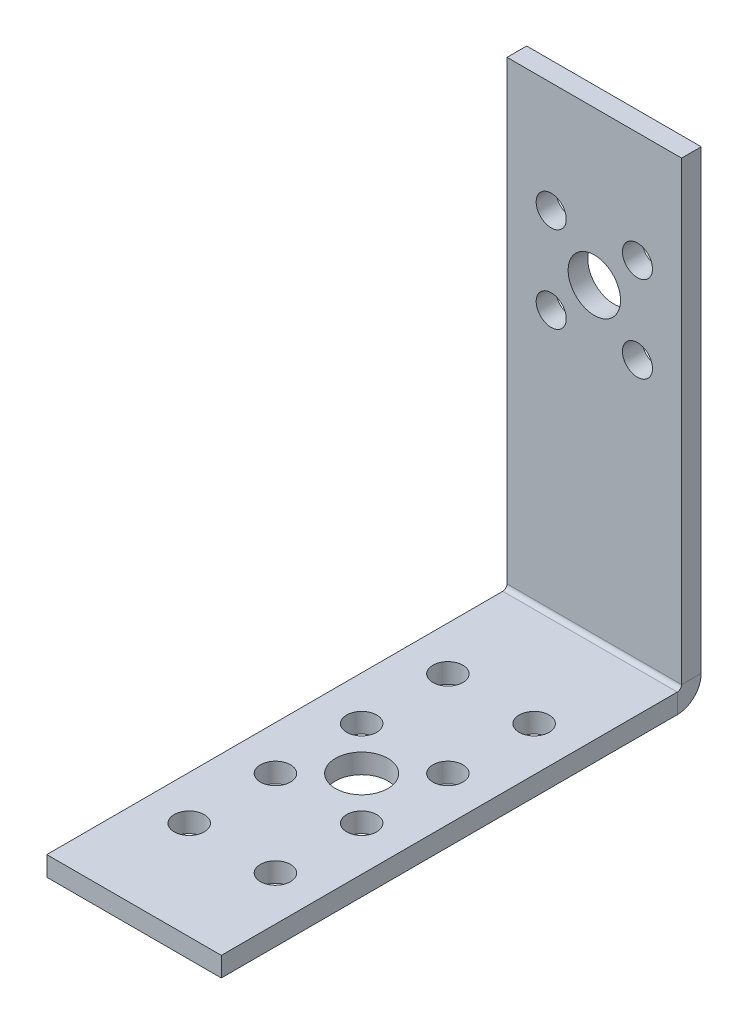
ISO-10303-21;
HEADER;
FILE_DESCRIPTION(('STEP AP214'),'2;1');
FILE_NAME('part.step','',(''),(''),'','','');
FILE_SCHEMA(('AUTOMOTIVE_DESIGN { 1 0 10303 214 1 1 1 1 }'));
ENDSEC;
DATA;
#1=APPLICATION_CONTEXT('core data for automotive mechanical design processes');
#2=APPLICATION_PROTOCOL_DEFINITION('international standard','automotive_design',2000,#1);
#3=PRODUCT_CONTEXT('',#1,'mechanical');
#4=PRODUCT('Part','Part','',(#3));
#5=PRODUCT_RELATED_PRODUCT_CATEGORY('part','',(#4));
#6=PRODUCT_DEFINITION_FORMATION('','',#4);
#7=PRODUCT_DEFINITION_CONTEXT('part definition',#1,'design');
#8=PRODUCT_DEFINITION('design','',#6,#7);
#9=PRODUCT_DEFINITION_SHAPE('','',#8);
#10=(LENGTH_UNIT() NAMED_UNIT(*) SI_UNIT(.MILLI.,.METRE.));
#11=(NAMED_UNIT(*) PLANE_ANGLE_UNIT() SI_UNIT($,.RADIAN.));
#12=(NAMED_UNIT(*) SI_UNIT($,.STERADIAN.) SOLID_ANGLE_UNIT());
#13=UNCERTAINTY_MEASURE_WITH_UNIT(LENGTH_MEASURE(1.E-05),#10,'distance_accuracy_value','');
#14=(GEOMETRIC_REPRESENTATION_CONTEXT(3) GLOBAL_UNCERTAINTY_ASSIGNED_CONTEXT((#13)) GLOBAL_UNIT_ASSIGNED_CONTEXT((#10,
#11,#12)) REPRESENTATION_CONTEXT('',''));
#15=CARTESIAN_POINT('',(0.,0.,0.));
#16=DIRECTION('',(0.,0.,1.));
#17=DIRECTION('',(1.,0.,0.));
#18=AXIS2_PLACEMENT_3D('',#15,#16,#17);
#19=CARTESIAN_POINT('',(-10.16,-2.286,27.94));
#20=DIRECTION('',(-1.,0.,0.));
#21=DIRECTION('',(0.,0.,1.));
#22=AXIS2_PLACEMENT_3D('',#19,#20,#21);
#23=PLANE('',#22);
#24=DIRECTION('',(0.,0.,1.));
#25=VECTOR('',#24,1.);
#26=CARTESIAN_POINT('',(-10.16,0.,27.94));
#27=LINE('',#26,#25);
#28=CARTESIAN_POINT('',(-10.16,0.,-25.154));
#29=VERTEX_POINT('',#28);
#30=CARTESIAN_POINT('',(-10.16,0.,27.94));
#31=VERTEX_POINT('',#30);
#32=EDGE_CURVE('E119',#29,#31,#27,.T.);
#33=ORIENTED_EDGE('',*,*,#32,.F.);
#34=DIRECTION('',(0.,-1.,0.));
#35=VECTOR('',#34,1.);
#36=CARTESIAN_POINT('',(-10.16,0.,-25.154));
#37=LINE('',#36,#35);
#38=CARTESIAN_POINT('',(-10.16,-2.28600000000001,-25.154));
#39=VERTEX_POINT('',#38);
#40=EDGE_CURVE('E163',#29,#39,#37,.T.);
#41=ORIENTED_EDGE('',*,*,#40,.T.);
#42=DIRECTION('',(0.,0.,1.));
#43=VECTOR('',#42,1.);
#44=CARTESIAN_POINT('',(-10.16,-2.286,27.94));
#45=LINE('',#44,#43);
#46=CARTESIAN_POINT('',(-10.16,-2.286,27.94));
#47=VERTEX_POINT('',#46);
#48=EDGE_CURVE('E115',#39,#47,#45,.T.);
#49=ORIENTED_EDGE('',*,*,#48,.T.);
#50=DIRECTION('',(0.,1.,0.));
#51=VECTOR('',#50,1.);
#52=CARTESIAN_POINT('',(-10.16,-2.286,27.94));
#53=LINE('',#52,#51);
#54=EDGE_CURVE('E73',#47,#31,#53,.T.);
#55=ORIENTED_EDGE('',*,*,#54,.T.);
#56=EDGE_LOOP('',(#33,#41,#49,#55));
#57=FACE_BOUND('',#56,.T.);
#58=ADVANCED_FACE('F65',(#57),#23,.T.);
#59=CARTESIAN_POINT('',(0.,-2.286,0.));
#60=DIRECTION('',(0.,-1.,0.));
#61=DIRECTION('',(0.,0.,-1.));
#62=AXIS2_PLACEMENT_3D('',#59,#60,#61);
#63=PLANE('',#62);
#64=CARTESIAN_POINT('',(-5.03045816676045,-2.28600000000001,16.4873744413615));
#65=DIRECTION('',(0.,1.,0.));
#66=DIRECTION('',(0.,0.,1.));
#67=AXIS2_PLACEMENT_3D('',#64,#65,#66);
#68=CIRCLE('',#67,1.75);
#69=CARTESIAN_POINT('',(-5.03045816676045,-2.28600000000001,18.2373744413615));
#70=VERTEX_POINT('',#69);
#71=EDGE_CURVE('E269',#70,#70,#68,.T.);
#72=ORIENTED_EDGE('',*,*,#71,.T.);
#73=EDGE_LOOP('',(#72));
#74=FACE_BOUND('',#73,.T.);
#75=CARTESIAN_POINT('',(-5.03045816676045,-2.28600000000001,-3.5944581443364));
#76=DIRECTION('',(0.,1.,0.));
#77=DIRECTION('',(0.,0.,1.));
#78=AXIS2_PLACEMENT_3D('',#75,#76,#77);
#79=CIRCLE('',#78,1.75);
#80=CARTESIAN_POINT('',(-5.03045816676045,-2.28600000000001,-1.8444581443364));
#81=VERTEX_POINT('',#80);
#82=EDGE_CURVE('E288',#81,#81,#79,.T.);
#83=ORIENTED_EDGE('',*,*,#82,.T.);
#84=EDGE_LOOP('',(#83));
#85=FACE_BOUND('',#84,.T.);
#86=CARTESIAN_POINT('',(5.01045812608854,-2.28600000000001,-13.6353744371854));
#87=DIRECTION('',(0.,1.,0.));
#88=DIRECTION('',(0.,0.,1.));
#89=AXIS2_PLACEMENT_3D('',#86,#87,#88);
#90=CIRCLE('',#89,1.75);
#91=CARTESIAN_POINT('',(5.01045812608854,-2.28600000000001,-11.8853744371854));
#92=VERTEX_POINT('',#91);
#93=EDGE_CURVE('E282',#92,#92,#90,.T.);
#94=ORIENTED_EDGE('',*,*,#93,.T.);
#95=EDGE_LOOP('',(#94));
#96=FACE_BOUND('',#95,.T.);
#97=CARTESIAN_POINT('',(5.01045812608854,-2.28600000000001,6.44645814851258));
#98=DIRECTION('',(0.,1.,0.));
#99=DIRECTION('',(0.,0.,1.));
#100=AXIS2_PLACEMENT_3D('',#97,#98,#99);
#101=CIRCLE('',#100,1.75);
#102=CARTESIAN_POINT('',(5.01045812608854,-2.28600000000001,8.19645814851258));
#103=VERTEX_POINT('',#102);
#104=EDGE_CURVE('E275',#103,#103,#101,.T.);
#105=ORIENTED_EDGE('',*,*,#104,.T.);
#106=EDGE_LOOP('',(#105));
#107=FACE_BOUND('',#106,.T.);
#108=CARTESIAN_POINT('',(5.01045812608854,-2.28600000000001,-3.5944581443364));
#109=DIRECTION('',(0.,1.,0.));
#110=DIRECTION('',(0.,0.,1.));
#111=AXIS2_PLACEMENT_3D('',#108,#109,#110);
#112=CIRCLE('',#111,1.75);
#113=CARTESIAN_POINT('',(5.01045812608854,-2.28600000000001,-1.8444581443364));
#114=VERTEX_POINT('',#113);
#115=EDGE_CURVE('E311',#114,#114,#112,.T.);
#116=ORIENTED_EDGE('',*,*,#115,.T.);
#117=EDGE_LOOP('',(#116));
#118=FACE_BOUND('',#117,.T.);
#119=CARTESIAN_POINT('',(-5.03045816676045,-2.28600000000001,6.44645814851258));
#120=DIRECTION('',(0.,1.,0.));
#121=DIRECTION('',(0.,0.,1.));
#122=AXIS2_PLACEMENT_3D('',#119,#120,#121);
#123=CIRCLE('',#122,1.75);
#124=CARTESIAN_POINT('',(-5.03045816676045,-2.28600000000001,8.19645814851258));
#125=VERTEX_POINT('',#124);
#126=EDGE_CURVE('E300',#125,#125,#123,.T.);
#127=ORIENTED_EDGE('',*,*,#126,.T.);
#128=EDGE_LOOP('',(#127));
#129=FACE_BOUND('',#128,.T.);
#130=CARTESIAN_POINT('',(-5.03045816676045,-2.28600000000001,-13.6353744371854));
#131=DIRECTION('',(0.,1.,0.));
#132=DIRECTION('',(0.,0.,1.));
#133=AXIS2_PLACEMENT_3D('',#130,#131,#132);
#134=CIRCLE('',#133,1.75);
#135=CARTESIAN_POINT('',(-5.03045816676045,-2.28600000000001,-11.8853744371854));
#136=VERTEX_POINT('',#135);
#137=EDGE_CURVE('E299',#136,#136,#134,.T.);
#138=ORIENTED_EDGE('',*,*,#137,.T.);
#139=EDGE_LOOP('',(#138));
#140=FACE_BOUND('',#139,.T.);
#141=CARTESIAN_POINT('',(5.01045812608854,-2.28600000000001,16.4873744413615));
#142=DIRECTION('',(0.,1.,0.));
#143=DIRECTION('',(0.,0.,1.));
#144=AXIS2_PLACEMENT_3D('',#141,#142,#143);
#145=CIRCLE('',#144,1.75);
#146=CARTESIAN_POINT('',(5.01045812608854,-2.28600000000001,18.2373744413615));
#147=VERTEX_POINT('',#146);
#148=EDGE_CURVE('E276',#147,#147,#145,.T.);
#149=ORIENTED_EDGE('',*,*,#148,.T.);
#150=EDGE_LOOP('',(#149));
#151=FACE_BOUND('',#150,.T.);
#152=CARTESIAN_POINT('',(-0.0100000203359513,-2.28600000000001,1.42600000208809));
#153=DIRECTION('',(0.,1.,0.));
#154=DIRECTION('',(0.,0.,1.));
#155=AXIS2_PLACEMENT_3D('',#152,#153,#154);
#156=CIRCLE('',#155,3.04999999999998);
#157=CARTESIAN_POINT('',(-0.0100000203359513,-2.28600000000001,4.47600000208808));
#158=VERTEX_POINT('',#157);
#159=EDGE_CURVE('E258',#158,#158,#156,.T.);
#160=ORIENTED_EDGE('',*,*,#159,.T.);
#161=EDGE_LOOP('',(#160));
#162=FACE_BOUND('',#161,.T.);
#163=ORIENTED_EDGE('',*,*,#48,.F.);
#164=DIRECTION('',(-1.,0.,0.));
#165=VECTOR('',#164,1.);
#166=CARTESIAN_POINT('',(-10.16,-2.28600000000001,-25.154));
#167=LINE('',#166,#165);
#168=CARTESIAN_POINT('',(10.16,-2.286,-25.154));
#169=VERTEX_POINT('',#168);
#170=EDGE_CURVE('E158',#39,#169,#167,.F.);
#171=ORIENTED_EDGE('',*,*,#170,.T.);
#172=DIRECTION('',(0.,0.,-1.));
#173=VECTOR('',#172,1.);
#174=CARTESIAN_POINT('',(10.16,-2.286,27.94));
#175=LINE('',#174,#173);
#176=CARTESIAN_POINT('',(10.16,-2.286,27.94));
#177=VERTEX_POINT('',#176);
#178=EDGE_CURVE('E126',#177,#169,#175,.T.);
#179=ORIENTED_EDGE('',*,*,#178,.F.);
#180=DIRECTION('',(1.,0.,0.));
#181=VECTOR('',#180,1.);
#182=CARTESIAN_POINT('',(-10.16,-2.286,27.94));
#183=LINE('',#182,#181);
#184=EDGE_CURVE('E106',#47,#177,#183,.T.);
#185=ORIENTED_EDGE('',*,*,#184,.F.);
#186=EDGE_LOOP('',(#163,#171,#179,#185));
#187=FACE_BOUND('',#186,.T.);
#188=ADVANCED_FACE('F182',(#74,#85,#96,#107,#118,#129,#140,#151,#162,#187),#63,.T.);
#189=CARTESIAN_POINT('',(0.,0.,0.));
#190=DIRECTION('',(0.,-1.,0.));
#191=DIRECTION('',(0.,0.,-1.));
#192=AXIS2_PLACEMENT_3D('',#189,#190,#191);
#193=PLANE('',#192);
#194=CARTESIAN_POINT('',(-5.03045816676045,0.,16.4873744413615));
#195=DIRECTION('',(0.,1.,0.));
#196=DIRECTION('',(0.,0.,1.));
#197=AXIS2_PLACEMENT_3D('',#194,#195,#196);
#198=CIRCLE('',#197,1.75);
#199=CARTESIAN_POINT('',(-5.03045816676045,0.,18.2373744413615));
#200=VERTEX_POINT('',#199);
#201=EDGE_CURVE('E291',#200,#200,#198,.T.);
#202=ORIENTED_EDGE('',*,*,#201,.F.);
#203=EDGE_LOOP('',(#202));
#204=FACE_BOUND('',#203,.T.);
#205=CARTESIAN_POINT('',(-5.03045816676045,0.,-3.5944581443364));
#206=DIRECTION('',(0.,1.,0.));
#207=DIRECTION('',(0.,0.,1.));
#208=AXIS2_PLACEMENT_3D('',#205,#206,#207);
#209=CIRCLE('',#208,1.75);
#210=CARTESIAN_POINT('',(-5.03045816676045,0.,-1.8444581443364));
#211=VERTEX_POINT('',#210);
#212=EDGE_CURVE('E285',#211,#211,#209,.T.);
#213=ORIENTED_EDGE('',*,*,#212,.F.);
#214=EDGE_LOOP('',(#213));
#215=FACE_BOUND('',#214,.T.);
#216=CARTESIAN_POINT('',(5.01045812608854,0.,-13.6353744371854));
#217=DIRECTION('',(0.,1.,0.));
#218=DIRECTION('',(0.,0.,1.));
#219=AXIS2_PLACEMENT_3D('',#216,#217,#218);
#220=CIRCLE('',#219,1.75);
#221=CARTESIAN_POINT('',(5.01045812608854,0.,-11.8853744371854));
#222=VERTEX_POINT('',#221);
#223=EDGE_CURVE('E279',#222,#222,#220,.T.);
#224=ORIENTED_EDGE('',*,*,#223,.F.);
#225=EDGE_LOOP('',(#224));
#226=FACE_BOUND('',#225,.T.);
#227=CARTESIAN_POINT('',(5.01045812608854,0.,6.44645814851258));
#228=DIRECTION('',(0.,1.,0.));
#229=DIRECTION('',(0.,0.,1.));
#230=AXIS2_PLACEMENT_3D('',#227,#228,#229);
#231=CIRCLE('',#230,1.75);
#232=CARTESIAN_POINT('',(5.01045812608854,0.,8.19645814851258));
#233=VERTEX_POINT('',#232);
#234=EDGE_CURVE('E272',#233,#233,#231,.T.);
#235=ORIENTED_EDGE('',*,*,#234,.F.);
#236=EDGE_LOOP('',(#235));
#237=FACE_BOUND('',#236,.T.);
#238=CARTESIAN_POINT('',(5.01045812608854,0.,-3.5944581443364));
#239=DIRECTION('',(0.,1.,0.));
#240=DIRECTION('',(0.,0.,1.));
#241=AXIS2_PLACEMENT_3D('',#238,#239,#240);
#242=CIRCLE('',#241,1.75);
#243=CARTESIAN_POINT('',(5.01045812608854,0.,-1.8444581443364));
#244=VERTEX_POINT('',#243);
#245=EDGE_CURVE('E308',#244,#244,#242,.T.);
#246=ORIENTED_EDGE('',*,*,#245,.F.);
#247=EDGE_LOOP('',(#246));
#248=FACE_BOUND('',#247,.T.);
#249=CARTESIAN_POINT('',(-5.03045816676045,0.,6.44645814851258));
#250=DIRECTION('',(0.,1.,0.));
#251=DIRECTION('',(0.,0.,1.));
#252=AXIS2_PLACEMENT_3D('',#249,#250,#251);
#253=CIRCLE('',#252,1.75);
#254=CARTESIAN_POINT('',(-5.03045816676045,0.,8.19645814851258));
#255=VERTEX_POINT('',#254);
#256=EDGE_CURVE('E314',#255,#255,#253,.T.);
#257=ORIENTED_EDGE('',*,*,#256,.F.);
#258=EDGE_LOOP('',(#257));
#259=FACE_BOUND('',#258,.T.);
#260=CARTESIAN_POINT('',(-5.03045816676045,0.,-13.6353744371854));
#261=DIRECTION('',(0.,1.,0.));
#262=DIRECTION('',(0.,0.,1.));
#263=AXIS2_PLACEMENT_3D('',#260,#261,#262);
#264=CIRCLE('',#263,1.75);
#265=CARTESIAN_POINT('',(-5.03045816676045,0.,-11.8853744371854));
#266=VERTEX_POINT('',#265);
#267=EDGE_CURVE('E296',#266,#266,#264,.T.);
#268=ORIENTED_EDGE('',*,*,#267,.F.);
#269=EDGE_LOOP('',(#268));
#270=FACE_BOUND('',#269,.T.);
#271=CARTESIAN_POINT('',(5.01045812608854,0.,16.4873744413615));
#272=DIRECTION('',(0.,1.,0.));
#273=DIRECTION('',(0.,0.,1.));
#274=AXIS2_PLACEMENT_3D('',#271,#272,#273);
#275=CIRCLE('',#274,1.75);
#276=CARTESIAN_POINT('',(5.01045812608854,0.,18.2373744413615));
#277=VERTEX_POINT('',#276);
#278=EDGE_CURVE('E303',#277,#277,#275,.T.);
#279=ORIENTED_EDGE('',*,*,#278,.F.);
#280=EDGE_LOOP('',(#279));
#281=FACE_BOUND('',#280,.T.);
#282=CARTESIAN_POINT('',(-0.0100000203359513,0.,1.42600000208809));
#283=DIRECTION('',(0.,1.,0.));
#284=DIRECTION('',(0.,0.,1.));
#285=AXIS2_PLACEMENT_3D('',#282,#283,#284);
#286=CIRCLE('',#285,3.04999999999998);
#287=CARTESIAN_POINT('',(-0.0100000203359513,0.,4.47600000208808));
#288=VERTEX_POINT('',#287);
#289=EDGE_CURVE('E266',#288,#288,#286,.T.);
#290=ORIENTED_EDGE('',*,*,#289,.F.);
#291=EDGE_LOOP('',(#290));
#292=FACE_BOUND('',#291,.T.);
#293=DIRECTION('',(-1.,0.,0.));
#294=VECTOR('',#293,1.);
#295=CARTESIAN_POINT('',(-10.16,0.,-25.154));
#296=LINE('',#295,#294);
#297=CARTESIAN_POINT('',(10.16,0.,-25.154));
#298=VERTEX_POINT('',#297);
#299=EDGE_CURVE('E169',#29,#298,#296,.F.);
#300=ORIENTED_EDGE('',*,*,#299,.F.);
#301=ORIENTED_EDGE('',*,*,#32,.T.);
#302=DIRECTION('',(1.,0.,0.));
#303=VECTOR('',#302,1.);
#304=CARTESIAN_POINT('',(-10.16,0.,27.94));
#305=LINE('',#304,#303);
#306=CARTESIAN_POINT('',(10.16,0.,27.94));
#307=VERTEX_POINT('',#306);
#308=EDGE_CURVE('E104',#31,#307,#305,.T.);
#309=ORIENTED_EDGE('',*,*,#308,.T.);
#310=DIRECTION('',(0.,0.,-1.));
#311=VECTOR('',#310,1.);
#312=CARTESIAN_POINT('',(10.16,0.,27.94));
#313=LINE('',#312,#311);
#314=EDGE_CURVE('E109',#307,#298,#313,.T.);
#315=ORIENTED_EDGE('',*,*,#314,.T.);
#316=EDGE_LOOP('',(#300,#301,#309,#315));
#317=FACE_BOUND('',#316,.T.);
#318=ADVANCED_FACE('F117',(#204,#215,#226,#237,#248,#259,#270,#281,#292,#317),#193,.F.);
#319=CARTESIAN_POINT('',(10.16,-2.286,27.94));
#320=DIRECTION('',(1.,0.,0.));
#321=DIRECTION('',(0.,0.,-1.));
#322=AXIS2_PLACEMENT_3D('',#319,#320,#321);
#323=PLANE('',#322);
#324=DIRECTION('',(0.,-1.,0.));
#325=VECTOR('',#324,1.);
#326=CARTESIAN_POINT('',(10.16,0.,-25.154));
#327=LINE('',#326,#325);
#328=EDGE_CURVE('E112',#298,#169,#327,.T.);
#329=ORIENTED_EDGE('',*,*,#328,.F.);
#330=ORIENTED_EDGE('',*,*,#314,.F.);
#331=DIRECTION('',(0.,1.,0.));
#332=VECTOR('',#331,1.);
#333=CARTESIAN_POINT('',(10.16,-2.286,27.94));
#334=LINE('',#333,#332);
#335=EDGE_CURVE('E13',#177,#307,#334,.T.);
#336=ORIENTED_EDGE('',*,*,#335,.F.);
#337=ORIENTED_EDGE('',*,*,#178,.T.);
#338=EDGE_LOOP('',(#329,#330,#336,#337));
#339=FACE_BOUND('',#338,.T.);
#340=ADVANCED_FACE('F110',(#339),#323,.T.);
#341=CARTESIAN_POINT('',(-10.16,-2.286,27.94));
#342=DIRECTION('',(0.,0.,1.));
#343=DIRECTION('',(1.,0.,0.));
#344=AXIS2_PLACEMENT_3D('',#341,#342,#343);
#345=PLANE('',#344);
#346=ORIENTED_EDGE('',*,*,#308,.F.);
#347=ORIENTED_EDGE('',*,*,#54,.F.);
#348=ORIENTED_EDGE('',*,*,#184,.T.);
#349=ORIENTED_EDGE('',*,*,#335,.T.);
#350=EDGE_LOOP('',(#346,#347,#348,#349));
#351=FACE_BOUND('',#350,.T.);
#352=ADVANCED_FACE('F101',(#351),#345,.T.);
#353=CARTESIAN_POINT('',(10.16,0.499999999999994,-25.154));
#354=DIRECTION('',(1.,0.,0.));
#355=DIRECTION('',(0.,0.,-1.));
#356=AXIS2_PLACEMENT_3D('',#353,#354,#355);
#357=PLANE('',#356);
#358=DIRECTION('',(0.,0.,1.));
#359=VECTOR('',#358,1.);
#360=CARTESIAN_POINT('',(10.16,0.500000000000013,-27.94));
#361=LINE('',#360,#359);
#362=CARTESIAN_POINT('',(10.16,0.499999999999992,-25.654));
#363=VERTEX_POINT('',#362);
#364=CARTESIAN_POINT('',(10.16,0.499999999999984,-27.94));
#365=VERTEX_POINT('',#364);
#366=EDGE_CURVE('E141',#363,#365,#361,.F.);
#367=ORIENTED_EDGE('',*,*,#366,.F.);
#368=CARTESIAN_POINT('',(10.16,0.499999999999994,-25.154));
#369=DIRECTION('',(-1.,0.,0.));
#370=DIRECTION('',(0.,0.,1.));
#371=AXIS2_PLACEMENT_3D('',#368,#369,#370);
#372=CIRCLE('',#371,0.5);
#373=EDGE_CURVE('E166',#298,#363,#372,.F.);
#374=ORIENTED_EDGE('',*,*,#373,.F.);
#375=ORIENTED_EDGE('',*,*,#328,.T.);
#376=CARTESIAN_POINT('',(10.16,0.499999999999994,-25.154));
#377=DIRECTION('',(-1.,0.,0.));
#378=DIRECTION('',(0.,0.,1.));
#379=AXIS2_PLACEMENT_3D('',#376,#377,#378);
#380=CIRCLE('',#379,2.786);
#381=EDGE_CURVE('E81',#169,#365,#380,.F.);
#382=ORIENTED_EDGE('',*,*,#381,.T.);
#383=EDGE_LOOP('',(#367,#374,#375,#382));
#384=FACE_BOUND('',#383,.T.);
#385=ADVANCED_FACE('F225',(#384),#357,.T.);
#386=CARTESIAN_POINT('',(-10.16,0.499999999999994,-25.154));
#387=DIRECTION('',(1.,0.,0.));
#388=DIRECTION('',(0.,0.,-1.));
#389=AXIS2_PLACEMENT_3D('',#386,#387,#388);
#390=PLANE('',#389);
#391=CARTESIAN_POINT('',(-10.16,0.499999999999994,-25.154));
#392=DIRECTION('',(-1.,0.,0.));
#393=DIRECTION('',(0.,0.,1.));
#394=AXIS2_PLACEMENT_3D('',#391,#392,#393);
#395=CIRCLE('',#394,0.5);
#396=CARTESIAN_POINT('',(-10.16,0.499999999999992,-25.654));
#397=VERTEX_POINT('',#396);
#398=EDGE_CURVE('E172',#397,#29,#395,.T.);
#399=ORIENTED_EDGE('',*,*,#398,.F.);
#400=DIRECTION('',(0.,0.,1.));
#401=VECTOR('',#400,1.);
#402=CARTESIAN_POINT('',(-10.16,0.499999999999997,-25.654));
#403=LINE('',#402,#401);
#404=CARTESIAN_POINT('',(-10.16,0.500000000000013,-27.94));
#405=VERTEX_POINT('',#404);
#406=EDGE_CURVE('E154',#397,#405,#403,.F.);
#407=ORIENTED_EDGE('',*,*,#406,.T.);
#408=CARTESIAN_POINT('',(-10.16,0.499999999999994,-25.154));
#409=DIRECTION('',(-1.,0.,0.));
#410=DIRECTION('',(0.,0.,1.));
#411=AXIS2_PLACEMENT_3D('',#408,#409,#410);
#412=CIRCLE('',#411,2.786);
#413=EDGE_CURVE('E161',#405,#39,#412,.T.);
#414=ORIENTED_EDGE('',*,*,#413,.T.);
#415=ORIENTED_EDGE('',*,*,#40,.F.);
#416=EDGE_LOOP('',(#399,#407,#414,#415));
#417=FACE_BOUND('',#416,.T.);
#418=ADVANCED_FACE('F191',(#417),#390,.F.);
#419=CARTESIAN_POINT('',(-10.16,0.499999999999994,-25.154));
#420=DIRECTION('',(-1.,0.,0.));
#421=DIRECTION('',(0.,0.,-1.));
#422=AXIS2_PLACEMENT_3D('',#419,#420,#421);
#423=CYLINDRICAL_SURFACE('',#422,2.786);
#424=ORIENTED_EDGE('',*,*,#170,.F.);
#425=ORIENTED_EDGE('',*,*,#413,.F.);
#426=DIRECTION('',(-1.,0.,0.));
#427=VECTOR('',#426,1.);
#428=CARTESIAN_POINT('',(10.16,0.500000000000013,-27.94));
#429=LINE('',#428,#427);
#430=EDGE_CURVE('E221',#405,#365,#429,.F.);
#431=ORIENTED_EDGE('',*,*,#430,.T.);
#432=ORIENTED_EDGE('',*,*,#381,.F.);
#433=EDGE_LOOP('',(#424,#425,#431,#432));
#434=FACE_BOUND('',#433,.T.);
#435=ADVANCED_FACE('F184',(#434),#423,.T.);
#436=CARTESIAN_POINT('',(-10.16,0.499999999999994,-25.154));
#437=DIRECTION('',(-1.,0.,0.));
#438=DIRECTION('',(0.,0.,-1.));
#439=AXIS2_PLACEMENT_3D('',#436,#437,#438);
#440=CYLINDRICAL_SURFACE('',#439,0.5);
#441=ORIENTED_EDGE('',*,*,#299,.T.);
#442=ORIENTED_EDGE('',*,*,#373,.T.);
#443=DIRECTION('',(-1.,0.,0.));
#444=VECTOR('',#443,1.);
#445=CARTESIAN_POINT('',(10.16,0.499999999999997,-25.654));
#446=LINE('',#445,#444);
#447=EDGE_CURVE('E145',#363,#397,#446,.T.);
#448=ORIENTED_EDGE('',*,*,#447,.T.);
#449=ORIENTED_EDGE('',*,*,#398,.T.);
#450=EDGE_LOOP('',(#441,#442,#448,#449));
#451=FACE_BOUND('',#450,.T.);
#452=ADVANCED_FACE('F228',(#451),#440,.F.);
#453=CARTESIAN_POINT('',(10.16,0.,-27.94));
#454=DIRECTION('',(-1.,0.,0.));
#455=DIRECTION('',(0.,0.,1.));
#456=AXIS2_PLACEMENT_3D('',#453,#454,#455);
#457=PLANE('',#456);
#458=ORIENTED_EDGE('',*,*,#366,.T.);
#459=DIRECTION('',(0.,-1.,0.));
#460=VECTOR('',#459,1.);
#461=CARTESIAN_POINT('',(10.16,-1.05652213044882E-13,-27.94));
#462=LINE('',#461,#460);
#463=CARTESIAN_POINT('',(10.16,53.594,-27.9400000000002));
#464=VERTEX_POINT('',#463);
#465=EDGE_CURVE('E243',#464,#365,#462,.T.);
#466=ORIENTED_EDGE('',*,*,#465,.F.);
#467=DIRECTION('',(0.,0.,1.));
#468=VECTOR('',#467,1.);
#469=CARTESIAN_POINT('',(10.16,53.594,-27.9400000000002));
#470=LINE('',#469,#468);
#471=CARTESIAN_POINT('',(10.16,53.594,-25.6540000000002));
#472=VERTEX_POINT('',#471);
#473=EDGE_CURVE('E237',#464,#472,#470,.T.);
#474=ORIENTED_EDGE('',*,*,#473,.T.);
#475=DIRECTION('',(0.,1.,0.));
#476=VECTOR('',#475,1.);
#477=CARTESIAN_POINT('',(10.16,0.,-25.654));
#478=LINE('',#477,#476);
#479=EDGE_CURVE('E223',#472,#363,#478,.F.);
#480=ORIENTED_EDGE('',*,*,#479,.T.);
#481=EDGE_LOOP('',(#458,#466,#474,#480));
#482=FACE_BOUND('',#481,.T.);
#483=ADVANCED_FACE('F236',(#482),#457,.F.);
#484=CARTESIAN_POINT('',(-10.16,53.594,-27.9400000000002));
#485=DIRECTION('',(1.,0.,0.));
#486=DIRECTION('',(0.,0.,-1.));
#487=AXIS2_PLACEMENT_3D('',#484,#485,#486);
#488=PLANE('',#487);
#489=ORIENTED_EDGE('',*,*,#406,.F.);
#490=DIRECTION('',(0.,-1.,0.));
#491=VECTOR('',#490,1.);
#492=CARTESIAN_POINT('',(-10.16,53.594,-25.6540000000002));
#493=LINE('',#492,#491);
#494=CARTESIAN_POINT('',(-10.16,53.594,-25.6540000000002));
#495=VERTEX_POINT('',#494);
#496=EDGE_CURVE('E234',#397,#495,#493,.F.);
#497=ORIENTED_EDGE('',*,*,#496,.T.);
#498=DIRECTION('',(0.,0.,1.));
#499=VECTOR('',#498,1.);
#500=CARTESIAN_POINT('',(-10.16,53.594,-27.9400000000002));
#501=LINE('',#500,#499);
#502=CARTESIAN_POINT('',(-10.16,53.594,-27.9400000000002));
#503=VERTEX_POINT('',#502);
#504=EDGE_CURVE('E175',#503,#495,#501,.T.);
#505=ORIENTED_EDGE('',*,*,#504,.F.);
#506=DIRECTION('',(0.,1.,0.));
#507=VECTOR('',#506,1.);
#508=CARTESIAN_POINT('',(-10.16,-1.05652213044882E-13,-27.94));
#509=LINE('',#508,#507);
#510=EDGE_CURVE('E245',#405,#503,#509,.T.);
#511=ORIENTED_EDGE('',*,*,#510,.F.);
#512=EDGE_LOOP('',(#489,#497,#505,#511));
#513=FACE_BOUND('',#512,.T.);
#514=ADVANCED_FACE('F384',(#513),#488,.F.);
#515=CARTESIAN_POINT('',(0.,-1.05652213044882E-13,-27.94));
#516=DIRECTION('',(0.,0.,1.));
#517=DIRECTION('',(0.,-1.,0.));
#518=AXIS2_PLACEMENT_3D('',#515,#516,#517);
#519=PLANE('',#518);
#520=CARTESIAN_POINT('',(-5.0204581464245,40.7159761518141,-27.9400000000001));
#521=DIRECTION('',(0.,0.,-1.));
#522=DIRECTION('',(0.,1.,0.));
#523=AXIS2_PLACEMENT_3D('',#520,#521,#522);
#524=CIRCLE('',#523,1.75);
#525=CARTESIAN_POINT('',(-5.0204581464245,42.4659761518141,-27.9400000000002));
#526=VERTEX_POINT('',#525);
#527=EDGE_CURVE('E254',#526,#526,#524,.T.);
#528=ORIENTED_EDGE('',*,*,#527,.F.);
#529=EDGE_LOOP('',(#528));
#530=FACE_BOUND('',#529,.T.);
#531=CARTESIAN_POINT('',(-5.02045814642451,30.6750598589651,-27.9400000000001));
#532=DIRECTION('',(0.,0.,-1.));
#533=DIRECTION('',(0.,1.,0.));
#534=AXIS2_PLACEMENT_3D('',#531,#532,#533);
#535=CIRCLE('',#534,1.75);
#536=CARTESIAN_POINT('',(-5.02045814642451,32.4250598589651,-27.9400000000001));
#537=VERTEX_POINT('',#536);
#538=EDGE_CURVE('E257',#537,#537,#535,.T.);
#539=ORIENTED_EDGE('',*,*,#538,.F.);
#540=EDGE_LOOP('',(#539));
#541=FACE_BOUND('',#540,.T.);
#542=CARTESIAN_POINT('',(5.02045814642447,30.6750598589651,-27.9400000000001));
#543=DIRECTION('',(0.,0.,-1.));
#544=DIRECTION('',(0.,1.,0.));
#545=AXIS2_PLACEMENT_3D('',#542,#543,#544);
#546=CIRCLE('',#545,1.75);
#547=CARTESIAN_POINT('',(5.02045814642447,32.4250598589651,-27.9400000000001));
#548=VERTEX_POINT('',#547);
#549=EDGE_CURVE('E261',#548,#548,#546,.T.);
#550=ORIENTED_EDGE('',*,*,#549,.F.);
#551=EDGE_LOOP('',(#550));
#552=FACE_BOUND('',#551,.T.);
#553=CARTESIAN_POINT('',(5.02045814642448,40.7159761518141,-27.9400000000001));
#554=DIRECTION('',(0.,0.,-1.));
#555=DIRECTION('',(0.,1.,0.));
#556=AXIS2_PLACEMENT_3D('',#553,#554,#555);
#557=CIRCLE('',#556,1.75);
#558=CARTESIAN_POINT('',(5.02045814642448,42.4659761518141,-27.9400000000002));
#559=VERTEX_POINT('',#558);
#560=EDGE_CURVE('E253',#559,#559,#557,.T.);
#561=ORIENTED_EDGE('',*,*,#560,.F.);
#562=EDGE_LOOP('',(#561));
#563=FACE_BOUND('',#562,.T.);
#564=CARTESIAN_POINT('',(0.,35.6955180053896,-27.9400000000001));
#565=DIRECTION('',(0.,0.,-1.));
#566=DIRECTION('',(0.,1.,0.));
#567=AXIS2_PLACEMENT_3D('',#564,#565,#566);
#568=CIRCLE('',#567,3.04999999999999);
#569=CARTESIAN_POINT('',(0.,38.7455180053896,-27.9400000000001));
#570=VERTEX_POINT('',#569);
#571=EDGE_CURVE('E131',#570,#570,#568,.T.);
#572=ORIENTED_EDGE('',*,*,#571,.F.);
#573=EDGE_LOOP('',(#572));
#574=FACE_BOUND('',#573,.T.);
#575=ORIENTED_EDGE('',*,*,#430,.F.);
#576=ORIENTED_EDGE('',*,*,#510,.T.);
#577=DIRECTION('',(1.,0.,0.));
#578=VECTOR('',#577,1.);
#579=CARTESIAN_POINT('',(0.,53.594,-27.9400000000002));
#580=LINE('',#579,#578);
#581=EDGE_CURVE('E210',#503,#464,#580,.T.);
#582=ORIENTED_EDGE('',*,*,#581,.T.);
#583=ORIENTED_EDGE('',*,*,#465,.T.);
#584=EDGE_LOOP('',(#575,#576,#582,#583));
#585=FACE_BOUND('',#584,.T.);
#586=ADVANCED_FACE('F387',(#530,#541,#552,#563,#574,#585),#519,.F.);
#587=CARTESIAN_POINT('',(0.,0.,-25.654));
#588=DIRECTION('',(0.,0.,1.));
#589=DIRECTION('',(0.,-1.,0.));
#590=AXIS2_PLACEMENT_3D('',#587,#588,#589);
#591=PLANE('',#590);
#592=CARTESIAN_POINT('',(-5.0204581464245,40.7159761518141,-25.6540000000001));
#593=DIRECTION('',(0.,0.,1.));
#594=DIRECTION('',(0.,-1.,0.));
#595=AXIS2_PLACEMENT_3D('',#592,#593,#594);
#596=CIRCLE('',#595,1.75);
#597=CARTESIAN_POINT('',(-5.0204581464245,38.9659761518141,-25.6540000000001));
#598=VERTEX_POINT('',#597);
#599=EDGE_CURVE('E68',#598,#598,#596,.T.);
#600=ORIENTED_EDGE('',*,*,#599,.F.);
#601=EDGE_LOOP('',(#600));
#602=FACE_BOUND('',#601,.T.);
#603=CARTESIAN_POINT('',(-5.02045814642451,30.6750598589651,-25.6540000000001));
#604=DIRECTION('',(0.,0.,1.));
#605=DIRECTION('',(0.,-1.,0.));
#606=AXIS2_PLACEMENT_3D('',#603,#604,#605);
#607=CIRCLE('',#606,1.75);
#608=CARTESIAN_POINT('',(-5.02045814642451,28.9250598589651,-25.6540000000001));
#609=VERTEX_POINT('',#608);
#610=EDGE_CURVE('E136',#609,#609,#607,.T.);
#611=ORIENTED_EDGE('',*,*,#610,.F.);
#612=EDGE_LOOP('',(#611));
#613=FACE_BOUND('',#612,.T.);
#614=CARTESIAN_POINT('',(5.02045814642447,30.6750598589651,-25.6540000000001));
#615=DIRECTION('',(0.,0.,1.));
#616=DIRECTION('',(0.,-1.,0.));
#617=AXIS2_PLACEMENT_3D('',#614,#615,#616);
#618=CIRCLE('',#617,1.75);
#619=CARTESIAN_POINT('',(5.02045814642447,28.9250598589651,-25.6540000000001));
#620=VERTEX_POINT('',#619);
#621=EDGE_CURVE('E134',#620,#620,#618,.T.);
#622=ORIENTED_EDGE('',*,*,#621,.F.);
#623=EDGE_LOOP('',(#622));
#624=FACE_BOUND('',#623,.T.);
#625=CARTESIAN_POINT('',(5.02045814642448,40.7159761518141,-25.6540000000001));
#626=DIRECTION('',(0.,0.,1.));
#627=DIRECTION('',(0.,-1.,0.));
#628=AXIS2_PLACEMENT_3D('',#625,#626,#627);
#629=CIRCLE('',#628,1.75);
#630=CARTESIAN_POINT('',(5.02045814642448,38.9659761518141,-25.6540000000001));
#631=VERTEX_POINT('',#630);
#632=EDGE_CURVE('E130',#631,#631,#629,.T.);
#633=ORIENTED_EDGE('',*,*,#632,.F.);
#634=EDGE_LOOP('',(#633));
#635=FACE_BOUND('',#634,.T.);
#636=CARTESIAN_POINT('',(0.,35.6955180053896,-25.6540000000001));
#637=DIRECTION('',(0.,0.,1.));
#638=DIRECTION('',(0.,-1.,0.));
#639=AXIS2_PLACEMENT_3D('',#636,#637,#638);
#640=CIRCLE('',#639,3.04999999999999);
#641=CARTESIAN_POINT('',(0.,32.6455180053896,-25.6540000000001));
#642=VERTEX_POINT('',#641);
#643=EDGE_CURVE('E127',#642,#642,#640,.T.);
#644=ORIENTED_EDGE('',*,*,#643,.F.);
#645=EDGE_LOOP('',(#644));
#646=FACE_BOUND('',#645,.T.);
#647=ORIENTED_EDGE('',*,*,#496,.F.);
#648=ORIENTED_EDGE('',*,*,#447,.F.);
#649=ORIENTED_EDGE('',*,*,#479,.F.);
#650=DIRECTION('',(-1.,0.,0.));
#651=VECTOR('',#650,1.);
#652=CARTESIAN_POINT('',(10.16,53.594,-25.6540000000002));
#653=LINE('',#652,#651);
#654=EDGE_CURVE('E239',#495,#472,#653,.F.);
#655=ORIENTED_EDGE('',*,*,#654,.F.);
#656=EDGE_LOOP('',(#647,#648,#649,#655));
#657=FACE_BOUND('',#656,.T.);
#658=ADVANCED_FACE('F232',(#602,#613,#624,#635,#646,#657),#591,.T.);
#659=CARTESIAN_POINT('',(10.16,53.594,-27.9400000000002));
#660=DIRECTION('',(0.,-1.,0.));
#661=DIRECTION('',(0.,0.,-1.));
#662=AXIS2_PLACEMENT_3D('',#659,#660,#661);
#663=PLANE('',#662);
#664=ORIENTED_EDGE('',*,*,#654,.T.);
#665=ORIENTED_EDGE('',*,*,#473,.F.);
#666=ORIENTED_EDGE('',*,*,#581,.F.);
#667=ORIENTED_EDGE('',*,*,#504,.T.);
#668=EDGE_LOOP('',(#664,#665,#666,#667));
#669=FACE_BOUND('',#668,.T.);
#670=ADVANCED_FACE('F389',(#669),#663,.F.);
#671=CARTESIAN_POINT('',(0.,35.6955180053898,27.9400000000001));
#672=DIRECTION('',(0.,0.,-1.));
#673=DIRECTION('',(0.,1.,0.));
#674=AXIS2_PLACEMENT_3D('',#671,#672,#673);
#675=CYLINDRICAL_SURFACE('',#674,3.04999999999999);
#676=ORIENTED_EDGE('',*,*,#643,.T.);
#677=EDGE_LOOP('',(#676));
#678=FACE_BOUND('',#677,.T.);
#679=ORIENTED_EDGE('',*,*,#571,.T.);
#680=EDGE_LOOP('',(#679));
#681=FACE_BOUND('',#680,.T.);
#682=ADVANCED_FACE('F392',(#678,#681),#675,.F.);
#683=CARTESIAN_POINT('',(5.02045814642448,40.7159761518143,27.94));
#684=DIRECTION('',(0.,0.,-1.));
#685=DIRECTION('',(0.,1.,0.));
#686=AXIS2_PLACEMENT_3D('',#683,#684,#685);
#687=CYLINDRICAL_SURFACE('',#686,1.75);
#688=ORIENTED_EDGE('',*,*,#632,.T.);
#689=EDGE_LOOP('',(#688));
#690=FACE_BOUND('',#689,.T.);
#691=ORIENTED_EDGE('',*,*,#560,.T.);
#692=EDGE_LOOP('',(#691));
#693=FACE_BOUND('',#692,.T.);
#694=ADVANCED_FACE('F401',(#690,#693),#687,.F.);
#695=CARTESIAN_POINT('',(5.02045814642447,30.6750598589653,27.9400000000001));
#696=DIRECTION('',(0.,0.,-1.));
#697=DIRECTION('',(0.,1.,0.));
#698=AXIS2_PLACEMENT_3D('',#695,#696,#697);
#699=CYLINDRICAL_SURFACE('',#698,1.75);
#700=ORIENTED_EDGE('',*,*,#621,.T.);
#701=EDGE_LOOP('',(#700));
#702=FACE_BOUND('',#701,.T.);
#703=ORIENTED_EDGE('',*,*,#549,.T.);
#704=EDGE_LOOP('',(#703));
#705=FACE_BOUND('',#704,.T.);
#706=ADVANCED_FACE('F406',(#702,#705),#699,.F.);
#707=CARTESIAN_POINT('',(-5.02045814642451,30.6750598589653,27.9400000000001));
#708=DIRECTION('',(0.,0.,-1.));
#709=DIRECTION('',(0.,1.,0.));
#710=AXIS2_PLACEMENT_3D('',#707,#708,#709);
#711=CYLINDRICAL_SURFACE('',#710,1.75);
#712=ORIENTED_EDGE('',*,*,#610,.T.);
#713=EDGE_LOOP('',(#712));
#714=FACE_BOUND('',#713,.T.);
#715=ORIENTED_EDGE('',*,*,#538,.T.);
#716=EDGE_LOOP('',(#715));
#717=FACE_BOUND('',#716,.T.);
#718=ADVANCED_FACE('F352',(#714,#717),#711,.F.);
#719=CARTESIAN_POINT('',(-5.0204581464245,40.7159761518143,27.94));
#720=DIRECTION('',(0.,0.,-1.));
#721=DIRECTION('',(0.,1.,0.));
#722=AXIS2_PLACEMENT_3D('',#719,#720,#721);
#723=CYLINDRICAL_SURFACE('',#722,1.75);
#724=ORIENTED_EDGE('',*,*,#599,.T.);
#725=EDGE_LOOP('',(#724));
#726=FACE_BOUND('',#725,.T.);
#727=ORIENTED_EDGE('',*,*,#527,.T.);
#728=EDGE_LOOP('',(#727));
#729=FACE_BOUND('',#728,.T.);
#730=ADVANCED_FACE('F343',(#726,#729),#723,.F.);
#731=CARTESIAN_POINT('',(-0.0100000203359513,-2.28600000000001,1.42600000208809));
#732=DIRECTION('',(0.,1.,0.));
#733=DIRECTION('',(0.,0.,1.));
#734=AXIS2_PLACEMENT_3D('',#731,#732,#733);
#735=CYLINDRICAL_SURFACE('',#734,3.04999999999998);
#736=ORIENTED_EDGE('',*,*,#159,.F.);
#737=EDGE_LOOP('',(#736));
#738=FACE_BOUND('',#737,.T.);
#739=ORIENTED_EDGE('',*,*,#289,.T.);
#740=EDGE_LOOP('',(#739));
#741=FACE_BOUND('',#740,.T.);
#742=ADVANCED_FACE('F340',(#738,#741),#735,.F.);
#743=CARTESIAN_POINT('',(5.01045812608854,-2.28600000000001,16.4873744413615));
#744=DIRECTION('',(0.,1.,0.));
#745=DIRECTION('',(0.,0.,1.));
#746=AXIS2_PLACEMENT_3D('',#743,#744,#745);
#747=CYLINDRICAL_SURFACE('',#746,1.75);
#748=ORIENTED_EDGE('',*,*,#148,.F.);
#749=EDGE_LOOP('',(#748));
#750=FACE_BOUND('',#749,.T.);
#751=ORIENTED_EDGE('',*,*,#278,.T.);
#752=EDGE_LOOP('',(#751));
#753=FACE_BOUND('',#752,.T.);
#754=ADVANCED_FACE('F342',(#750,#753),#747,.F.);
#755=CARTESIAN_POINT('',(-5.03045816676045,-2.28600000000001,-13.6353744371854));
#756=DIRECTION('',(0.,1.,0.));
#757=DIRECTION('',(0.,0.,1.));
#758=AXIS2_PLACEMENT_3D('',#755,#756,#757);
#759=CYLINDRICAL_SURFACE('',#758,1.75);
#760=ORIENTED_EDGE('',*,*,#137,.F.);
#761=EDGE_LOOP('',(#760));
#762=FACE_BOUND('',#761,.T.);
#763=ORIENTED_EDGE('',*,*,#267,.T.);
#764=EDGE_LOOP('',(#763));
#765=FACE_BOUND('',#764,.T.);
#766=ADVANCED_FACE('F326',(#762,#765),#759,.F.);
#767=CARTESIAN_POINT('',(-5.03045816676045,-2.28600000000001,6.44645814851258));
#768=DIRECTION('',(0.,1.,0.));
#769=DIRECTION('',(0.,0.,1.));
#770=AXIS2_PLACEMENT_3D('',#767,#768,#769);
#771=CYLINDRICAL_SURFACE('',#770,1.75);
#772=ORIENTED_EDGE('',*,*,#126,.F.);
#773=EDGE_LOOP('',(#772));
#774=FACE_BOUND('',#773,.T.);
#775=ORIENTED_EDGE('',*,*,#256,.T.);
#776=EDGE_LOOP('',(#775));
#777=FACE_BOUND('',#776,.T.);
#778=ADVANCED_FACE('F322',(#774,#777),#771,.F.);
#779=CARTESIAN_POINT('',(5.01045812608854,-2.28600000000001,-3.5944581443364));
#780=DIRECTION('',(0.,1.,0.));
#781=DIRECTION('',(0.,0.,1.));
#782=AXIS2_PLACEMENT_3D('',#779,#780,#781);
#783=CYLINDRICAL_SURFACE('',#782,1.75);
#784=ORIENTED_EDGE('',*,*,#115,.F.);
#785=EDGE_LOOP('',(#784));
#786=FACE_BOUND('',#785,.T.);
#787=ORIENTED_EDGE('',*,*,#245,.T.);
#788=EDGE_LOOP('',(#787));
#789=FACE_BOUND('',#788,.T.);
#790=ADVANCED_FACE('F325',(#786,#789),#783,.F.);
#791=CARTESIAN_POINT('',(5.01045812608854,-2.28600000000001,6.44645814851258));
#792=DIRECTION('',(0.,1.,0.));
#793=DIRECTION('',(0.,0.,1.));
#794=AXIS2_PLACEMENT_3D('',#791,#792,#793);
#795=CYLINDRICAL_SURFACE('',#794,1.75);
#796=ORIENTED_EDGE('',*,*,#104,.F.);
#797=EDGE_LOOP('',(#796));
#798=FACE_BOUND('',#797,.T.);
#799=ORIENTED_EDGE('',*,*,#234,.T.);
#800=EDGE_LOOP('',(#799));
#801=FACE_BOUND('',#800,.T.);
#802=ADVANCED_FACE('F477',(#798,#801),#795,.F.);
#803=CARTESIAN_POINT('',(5.01045812608854,-2.28600000000001,-13.6353744371854));
#804=DIRECTION('',(0.,1.,0.));
#805=DIRECTION('',(0.,0.,1.));
#806=AXIS2_PLACEMENT_3D('',#803,#804,#805);
#807=CYLINDRICAL_SURFACE('',#806,1.75);
#808=ORIENTED_EDGE('',*,*,#93,.F.);
#809=EDGE_LOOP('',(#808));
#810=FACE_BOUND('',#809,.T.);
#811=ORIENTED_EDGE('',*,*,#223,.T.);
#812=EDGE_LOOP('',(#811));
#813=FACE_BOUND('',#812,.T.);
#814=ADVANCED_FACE('F487',(#810,#813),#807,.F.);
#815=CARTESIAN_POINT('',(-5.03045816676045,-2.28600000000001,-3.5944581443364));
#816=DIRECTION('',(0.,1.,0.));
#817=DIRECTION('',(0.,0.,1.));
#818=AXIS2_PLACEMENT_3D('',#815,#816,#817);
#819=CYLINDRICAL_SURFACE('',#818,1.75);
#820=ORIENTED_EDGE('',*,*,#82,.F.);
#821=EDGE_LOOP('',(#820));
#822=FACE_BOUND('',#821,.T.);
#823=ORIENTED_EDGE('',*,*,#212,.T.);
#824=EDGE_LOOP('',(#823));
#825=FACE_BOUND('',#824,.T.);
#826=ADVANCED_FACE('F496',(#822,#825),#819,.F.);
#827=CARTESIAN_POINT('',(-5.03045816676045,-2.28600000000001,16.4873744413615));
#828=DIRECTION('',(0.,1.,0.));
#829=DIRECTION('',(0.,0.,1.));
#830=AXIS2_PLACEMENT_3D('',#827,#828,#829);
#831=CYLINDRICAL_SURFACE('',#830,1.75);
#832=ORIENTED_EDGE('',*,*,#71,.F.);
#833=EDGE_LOOP('',(#832));
#834=FACE_BOUND('',#833,.T.);
#835=ORIENTED_EDGE('',*,*,#201,.T.);
#836=EDGE_LOOP('',(#835));
#837=FACE_BOUND('',#836,.T.);
#838=ADVANCED_FACE('F506',(#834,#837),#831,.F.);
#839=CLOSED_SHELL('',(#58,#188,#318,#340,#352,#385,#418,#435,#452,#483,#514,#586,#658,#670,#682,
#694,#706,#718,#730,#742,#754,#766,#778,#790,#802,#814,#826,#838));
#840=MANIFOLD_SOLID_BREP('B2',#839);
#841=ADVANCED_BREP_SHAPE_REPRESENTATION('',(#18,#840),#14);
#842=SHAPE_DEFINITION_REPRESENTATION(#9,#841);
ENDSEC;
END-ISO-10303-21;
